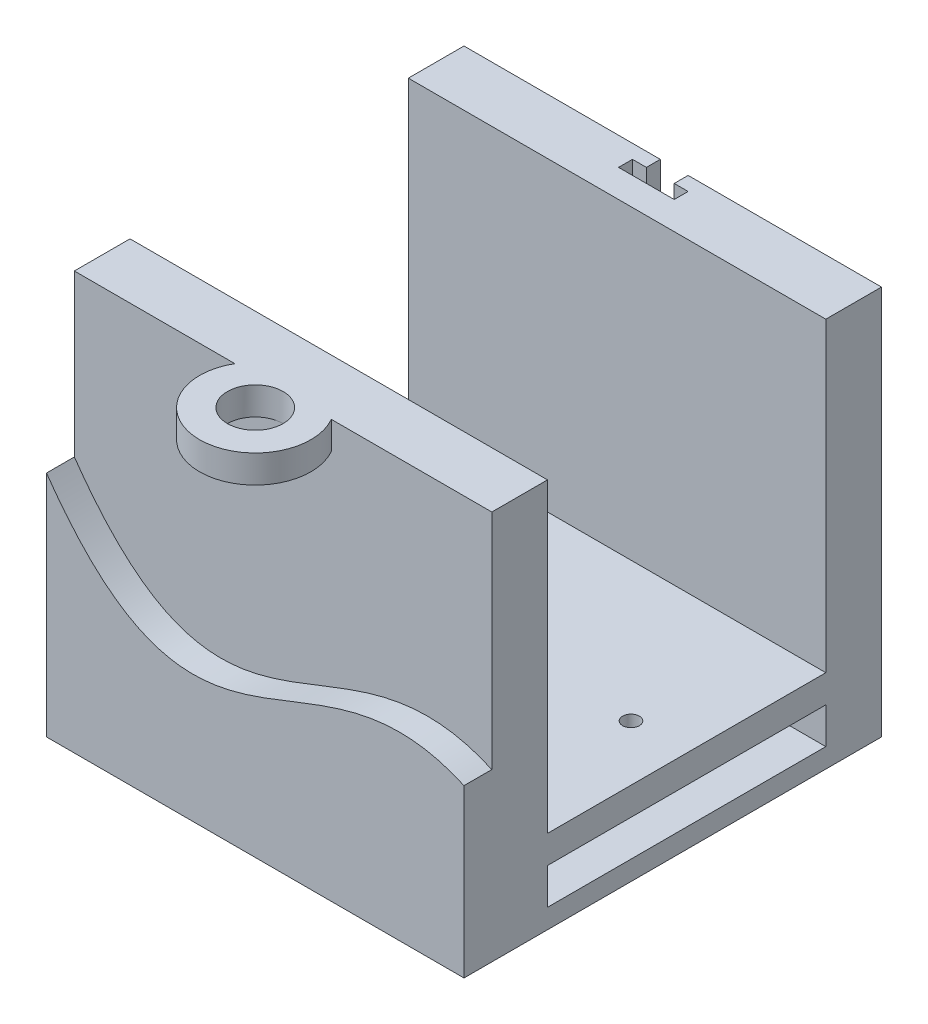
ISO-10303-21;
HEADER;
FILE_DESCRIPTION(('STEP AP214'),'2;1');
FILE_NAME('part.step','',(''),(''),'','','');
FILE_SCHEMA(('AUTOMOTIVE_DESIGN { 1 0 10303 214 1 1 1 1 }'));
ENDSEC;
DATA;
#1=APPLICATION_CONTEXT('core data for automotive mechanical design processes');
#2=APPLICATION_PROTOCOL_DEFINITION('international standard','automotive_design',2000,#1);
#3=PRODUCT_CONTEXT('',#1,'mechanical');
#4=PRODUCT('Part','Part','',(#3));
#5=PRODUCT_RELATED_PRODUCT_CATEGORY('part','',(#4));
#6=PRODUCT_DEFINITION_FORMATION('','',#4);
#7=PRODUCT_DEFINITION_CONTEXT('part definition',#1,'design');
#8=PRODUCT_DEFINITION('design','',#6,#7);
#9=PRODUCT_DEFINITION_SHAPE('','',#8);
#10=(LENGTH_UNIT() NAMED_UNIT(*) SI_UNIT(.MILLI.,.METRE.));
#11=(NAMED_UNIT(*) PLANE_ANGLE_UNIT() SI_UNIT($,.RADIAN.));
#12=(NAMED_UNIT(*) SI_UNIT($,.STERADIAN.) SOLID_ANGLE_UNIT());
#13=UNCERTAINTY_MEASURE_WITH_UNIT(LENGTH_MEASURE(1.E-05),#10,'distance_accuracy_value','');
#14=(GEOMETRIC_REPRESENTATION_CONTEXT(3) GLOBAL_UNCERTAINTY_ASSIGNED_CONTEXT((#13)) GLOBAL_UNIT_ASSIGNED_CONTEXT((#10,
#11,#12)) REPRESENTATION_CONTEXT('',''));
#15=CARTESIAN_POINT('',(0.,0.,0.));
#16=DIRECTION('',(0.,0.,1.));
#17=DIRECTION('',(1.,0.,0.));
#18=AXIS2_PLACEMENT_3D('',#15,#16,#17);
#19=CARTESIAN_POINT('',(-59.1428571428571,140.,104.214285714286));
#20=DIRECTION('',(0.,0.,-1.));
#21=DIRECTION('',(-1.,0.,0.));
#22=AXIS2_PLACEMENT_3D('',#19,#20,#21);
#23=PLANE('',#22);
#24=CARTESIAN_POINT('',(90.8571428571429,59.8589171198965,104.214285714286));
#25=CARTESIAN_POINT('',(33.520042850717,85.660046612702,104.214285714286));
#26=CARTESIAN_POINT('',(-2.26068441468296,0.574504188188582,104.214285714286));
#27=CARTESIAN_POINT('',(-59.1428571428571,82.1360500040591,104.214285714286));
#28=B_SPLINE_CURVE_WITH_KNOTS('',3,(#24,#25,#26,#27),.UNSPECIFIED.,.F.,.F.,(4,4),(0.,1.),.UNSPECIFIED.);
#29=CARTESIAN_POINT('',(90.8571428571429,59.8589171198965,104.214285714286));
#30=VERTEX_POINT('',#29);
#31=CARTESIAN_POINT('',(-59.1428571428571,82.1360500040591,104.214285714286));
#32=VERTEX_POINT('',#31);
#33=EDGE_CURVE('E58',#30,#32,#28,.T.);
#34=ORIENTED_EDGE('',*,*,#33,.F.);
#35=DIRECTION('',(0.,-1.,0.));
#36=VECTOR('',#35,1.);
#37=CARTESIAN_POINT('',(90.8571428571429,140.,104.214285714286));
#38=LINE('',#37,#36);
#39=CARTESIAN_POINT('',(90.8571428571429,140.,104.214285714286));
#40=VERTEX_POINT('',#39);
#41=EDGE_CURVE('E406',#40,#30,#38,.T.);
#42=ORIENTED_EDGE('',*,*,#41,.F.);
#43=DIRECTION('',(1.,0.,0.));
#44=VECTOR('',#43,1.);
#45=CARTESIAN_POINT('',(-59.1428571428571,140.,104.214285714286));
#46=LINE('',#45,#44);
#47=CARTESIAN_POINT('',(33.1776509328317,140.,104.214285714286));
#48=VERTEX_POINT('',#47);
#49=EDGE_CURVE('E383',#48,#40,#46,.T.);
#50=ORIENTED_EDGE('',*,*,#49,.F.);
#51=DIRECTION('',(0.,1.,0.));
#52=VECTOR('',#51,1.);
#53=CARTESIAN_POINT('',(33.1776509328317,130.,104.214285714286));
#54=LINE('',#53,#52);
#55=CARTESIAN_POINT('',(33.1776509328317,130.,104.214285714286));
#56=VERTEX_POINT('',#55);
#57=EDGE_CURVE('E296',#48,#56,#54,.F.);
#58=ORIENTED_EDGE('',*,*,#57,.T.);
#59=DIRECTION('',(1.,0.,0.));
#60=VECTOR('',#59,1.);
#61=CARTESIAN_POINT('',(-59.1428571428571,130.,104.214285714286));
#62=LINE('',#61,#60);
#63=CARTESIAN_POINT('',(15.8571428571429,130.,104.214285714286));
#64=VERTEX_POINT('',#63);
#65=EDGE_CURVE('E42',#64,#56,#62,.T.);
#66=ORIENTED_EDGE('',*,*,#65,.F.);
#67=CARTESIAN_POINT('',(-1.46336521854585,130.,104.214285714286));
#68=VERTEX_POINT('',#67);
#69=EDGE_CURVE('E12',#68,#64,#62,.T.);
#70=ORIENTED_EDGE('',*,*,#69,.F.);
#71=DIRECTION('',(0.,1.,0.));
#72=VECTOR('',#71,1.);
#73=CARTESIAN_POINT('',(-1.46336521854585,130.,104.214285714286));
#74=LINE('',#73,#72);
#75=CARTESIAN_POINT('',(-1.46336521854585,140.,104.214285714286));
#76=VERTEX_POINT('',#75);
#77=EDGE_CURVE('E300',#68,#76,#74,.T.);
#78=ORIENTED_EDGE('',*,*,#77,.T.);
#79=CARTESIAN_POINT('',(-59.1428571428571,140.,104.214285714286));
#80=VERTEX_POINT('',#79);
#81=EDGE_CURVE('E385',#80,#76,#46,.T.);
#82=ORIENTED_EDGE('',*,*,#81,.F.);
#83=DIRECTION('',(0.,-1.,0.));
#84=VECTOR('',#83,1.);
#85=CARTESIAN_POINT('',(-59.1428571428571,140.,104.214285714286));
#86=LINE('',#85,#84);
#87=EDGE_CURVE('E53',#80,#32,#86,.T.);
#88=ORIENTED_EDGE('',*,*,#87,.T.);
#89=EDGE_LOOP('',(#34,#42,#50,#58,#66,#70,#78,#82,#88));
#90=FACE_BOUND('',#89,.T.);
#91=ADVANCED_FACE('F38',(#90),#23,.F.);
#92=CARTESIAN_POINT('',(0.,140.,0.));
#93=DIRECTION('',(0.,1.,0.));
#94=DIRECTION('',(0.,0.,1.));
#95=AXIS2_PLACEMENT_3D('',#92,#93,#94);
#96=PLANE('',#95);
#97=DIRECTION('',(-1.,0.,0.));
#98=VECTOR('',#97,1.);
#99=CARTESIAN_POINT('',(6.38285753722225,140.,-30.7857142857143));
#100=LINE('',#99,#98);
#101=CARTESIAN_POINT('',(11.3828575372223,140.,-30.7857142857143));
#102=VERTEX_POINT('',#101);
#103=CARTESIAN_POINT('',(6.38285753722225,140.,-30.7857142857143));
#104=VERTEX_POINT('',#103);
#105=EDGE_CURVE('E246',#102,#104,#100,.T.);
#106=ORIENTED_EDGE('',*,*,#105,.F.);
#107=DIRECTION('',(0.,0.,1.));
#108=VECTOR('',#107,1.);
#109=CARTESIAN_POINT('',(11.3828575372222,140.,-35.7857142857143));
#110=LINE('',#109,#108);
#111=CARTESIAN_POINT('',(11.3828575372222,140.,-35.7857142857143));
#112=VERTEX_POINT('',#111);
#113=EDGE_CURVE('E278',#112,#102,#110,.T.);
#114=ORIENTED_EDGE('',*,*,#113,.F.);
#115=DIRECTION('',(-1.,0.,0.));
#116=VECTOR('',#115,1.);
#117=CARTESIAN_POINT('',(-59.1428571428571,140.,-35.7857142857143));
#118=LINE('',#117,#116);
#119=CARTESIAN_POINT('',(-59.1428571428571,140.,-35.7857142857143));
#120=VERTEX_POINT('',#119);
#121=EDGE_CURVE('E392',#112,#120,#118,.T.);
#122=ORIENTED_EDGE('',*,*,#121,.T.);
#123=DIRECTION('',(0.,0.,1.));
#124=VECTOR('',#123,1.);
#125=CARTESIAN_POINT('',(-59.1428571428571,140.,-35.7857142857143));
#126=LINE('',#125,#124);
#127=CARTESIAN_POINT('',(-59.1428571428571,140.,-15.7857142857143));
#128=VERTEX_POINT('',#127);
#129=EDGE_CURVE('E380',#120,#128,#126,.T.);
#130=ORIENTED_EDGE('',*,*,#129,.T.);
#131=DIRECTION('',(-1.,0.,0.));
#132=VECTOR('',#131,1.);
#133=CARTESIAN_POINT('',(-59.1428571428571,140.,-15.7857142857143));
#134=LINE('',#133,#132);
#135=CARTESIAN_POINT('',(90.8571428571429,140.,-15.7857142857143));
#136=VERTEX_POINT('',#135);
#137=EDGE_CURVE('E360',#136,#128,#134,.T.);
#138=ORIENTED_EDGE('',*,*,#137,.F.);
#139=DIRECTION('',(0.,0.,-1.));
#140=VECTOR('',#139,1.);
#141=CARTESIAN_POINT('',(90.8571428571429,140.,-35.7857142857143));
#142=LINE('',#141,#140);
#143=CARTESIAN_POINT('',(90.8571428571429,140.,-35.7857142857143));
#144=VERTEX_POINT('',#143);
#145=EDGE_CURVE('E388',#136,#144,#142,.T.);
#146=ORIENTED_EDGE('',*,*,#145,.T.);
#147=CARTESIAN_POINT('',(21.3828575372223,140.,-35.7857142857143));
#148=VERTEX_POINT('',#147);
#149=EDGE_CURVE('E393',#144,#148,#118,.T.);
#150=ORIENTED_EDGE('',*,*,#149,.T.);
#151=DIRECTION('',(0.,0.,-1.));
#152=VECTOR('',#151,1.);
#153=CARTESIAN_POINT('',(21.3828575372223,140.,-35.7857142857143));
#154=LINE('',#153,#152);
#155=CARTESIAN_POINT('',(21.3828575372223,140.,-30.7857142857143));
#156=VERTEX_POINT('',#155);
#157=EDGE_CURVE('E264',#156,#148,#154,.T.);
#158=ORIENTED_EDGE('',*,*,#157,.F.);
#159=CARTESIAN_POINT('',(26.3828575372223,140.,-30.7857142857143));
#160=VERTEX_POINT('',#159);
#161=EDGE_CURVE('E237',#160,#156,#100,.T.);
#162=ORIENTED_EDGE('',*,*,#161,.F.);
#163=DIRECTION('',(0.,0.,-1.));
#164=VECTOR('',#163,1.);
#165=CARTESIAN_POINT('',(26.3828575372223,140.,-25.7857142857143));
#166=LINE('',#165,#164);
#167=CARTESIAN_POINT('',(26.3828575372223,140.,-25.7857142857143));
#168=VERTEX_POINT('',#167);
#169=EDGE_CURVE('E228',#168,#160,#166,.T.);
#170=ORIENTED_EDGE('',*,*,#169,.F.);
#171=DIRECTION('',(1.,0.,0.));
#172=VECTOR('',#171,1.);
#173=CARTESIAN_POINT('',(21.3828575372223,140.,-25.7857142857143));
#174=LINE('',#173,#172);
#175=CARTESIAN_POINT('',(6.38285753722225,140.,-25.7857142857143));
#176=VERTEX_POINT('',#175);
#177=EDGE_CURVE('E268',#176,#168,#174,.T.);
#178=ORIENTED_EDGE('',*,*,#177,.F.);
#179=DIRECTION('',(0.,0.,1.));
#180=VECTOR('',#179,1.);
#181=CARTESIAN_POINT('',(6.38285753722225,140.,-25.7857142857143));
#182=LINE('',#181,#180);
#183=EDGE_CURVE('E224',#104,#176,#182,.T.);
#184=ORIENTED_EDGE('',*,*,#183,.F.);
#185=EDGE_LOOP('',(#106,#114,#122,#130,#138,#146,#150,#158,#162,#170,#178,#184));
#186=FACE_BOUND('',#185,.T.);
#187=ADVANCED_FACE('F434',(#186),#96,.T.);
#188=CARTESIAN_POINT('',(-59.1428571428571,140.,-35.7857142857143));
#189=DIRECTION('',(1.,0.,0.));
#190=DIRECTION('',(0.,0.,-1.));
#191=AXIS2_PLACEMENT_3D('',#188,#189,#190);
#192=PLANE('',#191);
#193=DIRECTION('',(0.,0.,1.));
#194=VECTOR('',#193,1.);
#195=CARTESIAN_POINT('',(-59.1428571428571,20.,84.2142857142858));
#196=LINE('',#195,#194);
#197=CARTESIAN_POINT('',(-59.1428571428572,20.,-15.7857142857143));
#198=VERTEX_POINT('',#197);
#199=CARTESIAN_POINT('',(-59.1428571428571,20.,84.2142857142858));
#200=VERTEX_POINT('',#199);
#201=EDGE_CURVE('E334',#198,#200,#196,.T.);
#202=ORIENTED_EDGE('',*,*,#201,.T.);
#203=DIRECTION('',(0.,-1.,0.));
#204=VECTOR('',#203,1.);
#205=CARTESIAN_POINT('',(-59.1428571428571,20.,84.2142857142858));
#206=LINE('',#205,#204);
#207=CARTESIAN_POINT('',(-59.1428571428571,7.,84.2142857142858));
#208=VERTEX_POINT('',#207);
#209=EDGE_CURVE('E324',#200,#208,#206,.T.);
#210=ORIENTED_EDGE('',*,*,#209,.T.);
#211=DIRECTION('',(0.,0.,-1.));
#212=VECTOR('',#211,1.);
#213=CARTESIAN_POINT('',(-59.1428571428571,7.,84.2142857142858));
#214=LINE('',#213,#212);
#215=CARTESIAN_POINT('',(-59.1428571428571,7.00000000000001,-15.7857142857143));
#216=VERTEX_POINT('',#215);
#217=EDGE_CURVE('E327',#208,#216,#214,.T.);
#218=ORIENTED_EDGE('',*,*,#217,.T.);
#219=DIRECTION('',(0.,1.,0.));
#220=VECTOR('',#219,1.);
#221=CARTESIAN_POINT('',(-59.1428571428572,20.,-15.7857142857143));
#222=LINE('',#221,#220);
#223=EDGE_CURVE('E331',#216,#198,#222,.T.);
#224=ORIENTED_EDGE('',*,*,#223,.T.);
#225=EDGE_LOOP('',(#202,#210,#218,#224));
#226=FACE_BOUND('',#225,.T.);
#227=DIRECTION('',(0.,0.,1.));
#228=VECTOR('',#227,1.);
#229=CARTESIAN_POINT('',(-59.1428571428571,30.,-15.7857142857143));
#230=LINE('',#229,#228);
#231=CARTESIAN_POINT('',(-59.1428571428571,30.,-15.7857142857143));
#232=VERTEX_POINT('',#231);
#233=CARTESIAN_POINT('',(-59.1428571428571,30.,84.2142857142857));
#234=VERTEX_POINT('',#233);
#235=EDGE_CURVE('E356',#232,#234,#230,.T.);
#236=ORIENTED_EDGE('',*,*,#235,.F.);
#237=DIRECTION('',(0.,1.,0.));
#238=VECTOR('',#237,1.);
#239=CARTESIAN_POINT('',(-59.1428571428571,30.,-15.7857142857143));
#240=LINE('',#239,#238);
#241=EDGE_CURVE('E371',#232,#128,#240,.T.);
#242=ORIENTED_EDGE('',*,*,#241,.T.);
#243=ORIENTED_EDGE('',*,*,#129,.F.);
#244=DIRECTION('',(0.,-1.,0.));
#245=VECTOR('',#244,1.);
#246=CARTESIAN_POINT('',(-59.1428571428571,140.,-35.7857142857143));
#247=LINE('',#246,#245);
#248=CARTESIAN_POINT('',(-59.1428571428571,0.,-35.7857142857143));
#249=VERTEX_POINT('',#248);
#250=EDGE_CURVE('E396',#120,#249,#247,.T.);
#251=ORIENTED_EDGE('',*,*,#250,.T.);
#252=DIRECTION('',(0.,0.,1.));
#253=VECTOR('',#252,1.);
#254=CARTESIAN_POINT('',(-59.1428571428571,0.,-35.7857142857143));
#255=LINE('',#254,#253);
#256=CARTESIAN_POINT('',(-59.1428571428571,0.,114.214285714286));
#257=VERTEX_POINT('',#256);
#258=EDGE_CURVE('E208',#249,#257,#255,.T.);
#259=ORIENTED_EDGE('',*,*,#258,.T.);
#260=DIRECTION('',(0.,-1.,0.));
#261=VECTOR('',#260,1.);
#262=CARTESIAN_POINT('',(-59.1428571428571,82.1360500040591,114.214285714286));
#263=LINE('',#262,#261);
#264=CARTESIAN_POINT('',(-59.1428571428571,82.1360500040591,114.214285714286));
#265=VERTEX_POINT('',#264);
#266=EDGE_CURVE('E201',#265,#257,#263,.T.);
#267=ORIENTED_EDGE('',*,*,#266,.F.);
#268=DIRECTION('',(0.,0.,-1.));
#269=VECTOR('',#268,1.);
#270=CARTESIAN_POINT('',(-59.1428571428571,82.1360500040591,114.214285714286));
#271=LINE('',#270,#269);
#272=EDGE_CURVE('E205',#265,#32,#271,.T.);
#273=ORIENTED_EDGE('',*,*,#272,.T.);
#274=ORIENTED_EDGE('',*,*,#87,.F.);
#275=CARTESIAN_POINT('',(-59.1428571428571,140.,84.2142857142857));
#276=VERTEX_POINT('',#275);
#277=EDGE_CURVE('E384',#276,#80,#126,.T.);
#278=ORIENTED_EDGE('',*,*,#277,.F.);
#279=DIRECTION('',(0.,1.,0.));
#280=VECTOR('',#279,1.);
#281=CARTESIAN_POINT('',(-59.1428571428571,30.,84.2142857142857));
#282=LINE('',#281,#280);
#283=EDGE_CURVE('E368',#234,#276,#282,.T.);
#284=ORIENTED_EDGE('',*,*,#283,.F.);
#285=EDGE_LOOP('',(#236,#242,#243,#251,#259,#267,#273,#274,#278,#284));
#286=FACE_BOUND('',#285,.T.);
#287=ADVANCED_FACE('F40',(#226,#286),#192,.F.);
#288=CARTESIAN_POINT('',(90.8571428571429,140.,-35.7857142857143));
#289=DIRECTION('',(-1.,0.,0.));
#290=DIRECTION('',(0.,0.,1.));
#291=AXIS2_PLACEMENT_3D('',#288,#289,#290);
#292=PLANE('',#291);
#293=DIRECTION('',(0.,0.,-1.));
#294=VECTOR('',#293,1.);
#295=CARTESIAN_POINT('',(90.8571428571429,7.,84.2142857142857));
#296=LINE('',#295,#294);
#297=CARTESIAN_POINT('',(90.8571428571429,7.00000000000001,84.2142857142857));
#298=VERTEX_POINT('',#297);
#299=CARTESIAN_POINT('',(90.8571428571429,7.,-15.7857142857143));
#300=VERTEX_POINT('',#299);
#301=EDGE_CURVE('E339',#298,#300,#296,.T.);
#302=ORIENTED_EDGE('',*,*,#301,.F.);
#303=DIRECTION('',(0.,-1.,0.));
#304=VECTOR('',#303,1.);
#305=CARTESIAN_POINT('',(90.8571428571429,20.,84.2142857142857));
#306=LINE('',#305,#304);
#307=CARTESIAN_POINT('',(90.8571428571429,20.,84.2142857142857));
#308=VERTEX_POINT('',#307);
#309=EDGE_CURVE('E323',#308,#298,#306,.T.);
#310=ORIENTED_EDGE('',*,*,#309,.F.);
#311=DIRECTION('',(0.,0.,1.));
#312=VECTOR('',#311,1.);
#313=CARTESIAN_POINT('',(90.8571428571429,20.,84.2142857142857));
#314=LINE('',#313,#312);
#315=CARTESIAN_POINT('',(90.8571428571429,20.,-15.7857142857143));
#316=VERTEX_POINT('',#315);
#317=EDGE_CURVE('E328',#316,#308,#314,.T.);
#318=ORIENTED_EDGE('',*,*,#317,.F.);
#319=DIRECTION('',(0.,1.,0.));
#320=VECTOR('',#319,1.);
#321=CARTESIAN_POINT('',(90.8571428571429,20.,-15.7857142857143));
#322=LINE('',#321,#320);
#323=EDGE_CURVE('E342',#300,#316,#322,.T.);
#324=ORIENTED_EDGE('',*,*,#323,.F.);
#325=EDGE_LOOP('',(#302,#310,#318,#324));
#326=FACE_BOUND('',#325,.T.);
#327=ORIENTED_EDGE('',*,*,#145,.F.);
#328=DIRECTION('',(0.,1.,0.));
#329=VECTOR('',#328,1.);
#330=CARTESIAN_POINT('',(90.8571428571429,30.,-15.7857142857143));
#331=LINE('',#330,#329);
#332=CARTESIAN_POINT('',(90.8571428571429,30.,-15.7857142857143));
#333=VERTEX_POINT('',#332);
#334=EDGE_CURVE('E374',#333,#136,#331,.T.);
#335=ORIENTED_EDGE('',*,*,#334,.F.);
#336=DIRECTION('',(0.,0.,-1.));
#337=VECTOR('',#336,1.);
#338=CARTESIAN_POINT('',(90.8571428571429,30.,-15.7857142857143));
#339=LINE('',#338,#337);
#340=CARTESIAN_POINT('',(90.8571428571429,30.,84.2142857142857));
#341=VERTEX_POINT('',#340);
#342=EDGE_CURVE('E363',#341,#333,#339,.T.);
#343=ORIENTED_EDGE('',*,*,#342,.F.);
#344=DIRECTION('',(0.,1.,0.));
#345=VECTOR('',#344,1.);
#346=CARTESIAN_POINT('',(90.8571428571429,30.,84.2142857142857));
#347=LINE('',#346,#345);
#348=CARTESIAN_POINT('',(90.8571428571429,140.,84.2142857142857));
#349=VERTEX_POINT('',#348);
#350=EDGE_CURVE('E376',#341,#349,#347,.T.);
#351=ORIENTED_EDGE('',*,*,#350,.T.);
#352=EDGE_CURVE('E389',#40,#349,#142,.T.);
#353=ORIENTED_EDGE('',*,*,#352,.F.);
#354=ORIENTED_EDGE('',*,*,#41,.T.);
#355=DIRECTION('',(0.,0.,-1.));
#356=VECTOR('',#355,1.);
#357=CARTESIAN_POINT('',(90.8571428571429,59.8589171198965,114.214285714286));
#358=LINE('',#357,#356);
#359=CARTESIAN_POINT('',(90.8571428571429,59.8589171198965,114.214285714286));
#360=VERTEX_POINT('',#359);
#361=EDGE_CURVE('E225',#360,#30,#358,.T.);
#362=ORIENTED_EDGE('',*,*,#361,.F.);
#363=DIRECTION('',(0.,1.,0.));
#364=VECTOR('',#363,1.);
#365=CARTESIAN_POINT('',(90.8571428571429,0.,114.214285714286));
#366=LINE('',#365,#364);
#367=CARTESIAN_POINT('',(90.8571428571429,0.,114.214285714286));
#368=VERTEX_POINT('',#367);
#369=EDGE_CURVE('E218',#368,#360,#366,.T.);
#370=ORIENTED_EDGE('',*,*,#369,.F.);
#371=DIRECTION('',(0.,0.,-1.));
#372=VECTOR('',#371,1.);
#373=CARTESIAN_POINT('',(90.8571428571429,0.,-35.7857142857143));
#374=LINE('',#373,#372);
#375=CARTESIAN_POINT('',(90.8571428571429,0.,-35.7857142857143));
#376=VERTEX_POINT('',#375);
#377=EDGE_CURVE('E398',#368,#376,#374,.T.);
#378=ORIENTED_EDGE('',*,*,#377,.T.);
#379=DIRECTION('',(0.,-1.,0.));
#380=VECTOR('',#379,1.);
#381=CARTESIAN_POINT('',(90.8571428571429,140.,-35.7857142857143));
#382=LINE('',#381,#380);
#383=EDGE_CURVE('E403',#144,#376,#382,.T.);
#384=ORIENTED_EDGE('',*,*,#383,.F.);
#385=EDGE_LOOP('',(#327,#335,#343,#351,#353,#354,#362,#370,#378,#384));
#386=FACE_BOUND('',#385,.T.);
#387=ADVANCED_FACE('F442',(#326,#386),#292,.F.);
#388=CARTESIAN_POINT('',(-59.1428571428571,140.,-35.7857142857143));
#389=DIRECTION('',(0.,0.,1.));
#390=DIRECTION('',(1.,0.,0.));
#391=AXIS2_PLACEMENT_3D('',#388,#389,#390);
#392=PLANE('',#391);
#393=DIRECTION('',(-1.,0.,0.));
#394=VECTOR('',#393,1.);
#395=CARTESIAN_POINT('',(21.3828575372223,20.,-35.7857142857143));
#396=LINE('',#395,#394);
#397=CARTESIAN_POINT('',(21.3828575372222,20.,-35.7857142857143));
#398=VERTEX_POINT('',#397);
#399=CARTESIAN_POINT('',(11.3828575372222,20.,-35.7857142857143));
#400=VERTEX_POINT('',#399);
#401=EDGE_CURVE('E267',#398,#400,#396,.T.);
#402=ORIENTED_EDGE('',*,*,#401,.F.);
#403=DIRECTION('',(0.,1.,0.));
#404=VECTOR('',#403,1.);
#405=CARTESIAN_POINT('',(21.3828575372223,20.,-35.7857142857143));
#406=LINE('',#405,#404);
#407=EDGE_CURVE('E276',#398,#148,#406,.T.);
#408=ORIENTED_EDGE('',*,*,#407,.T.);
#409=ORIENTED_EDGE('',*,*,#149,.F.);
#410=ORIENTED_EDGE('',*,*,#383,.T.);
#411=DIRECTION('',(-1.,0.,0.));
#412=VECTOR('',#411,1.);
#413=CARTESIAN_POINT('',(-59.1428571428571,0.,-35.7857142857143));
#414=LINE('',#413,#412);
#415=EDGE_CURVE('E400',#376,#249,#414,.T.);
#416=ORIENTED_EDGE('',*,*,#415,.T.);
#417=ORIENTED_EDGE('',*,*,#250,.F.);
#418=ORIENTED_EDGE('',*,*,#121,.F.);
#419=DIRECTION('',(0.,1.,0.));
#420=VECTOR('',#419,1.);
#421=CARTESIAN_POINT('',(11.3828575372222,20.,-35.7857142857143));
#422=LINE('',#421,#420);
#423=EDGE_CURVE('E282',#400,#112,#422,.T.);
#424=ORIENTED_EDGE('',*,*,#423,.F.);
#425=EDGE_LOOP('',(#402,#408,#409,#410,#416,#417,#418,#424));
#426=FACE_BOUND('',#425,.T.);
#427=ADVANCED_FACE('F445',(#426),#392,.F.);
#428=CARTESIAN_POINT('',(15.8571428571429,140.,114.214285714286));
#429=DIRECTION('',(0.,1.,0.));
#430=DIRECTION('',(0.,0.,1.));
#431=AXIS2_PLACEMENT_3D('',#428,#429,#430);
#432=CIRCLE('',#431,10.);
#433=CARTESIAN_POINT('',(15.8571428571429,140.,124.214285714286));
#434=VERTEX_POINT('',#433);
#435=EDGE_CURVE('E284',#434,#434,#432,.T.);
#436=ORIENTED_EDGE('',*,*,#435,.F.);
#437=EDGE_LOOP('',(#436));
#438=FACE_BOUND('',#437,.T.);
#439=ORIENTED_EDGE('',*,*,#81,.T.);
#440=CARTESIAN_POINT('',(15.8571428571429,140.,114.214285714286));
#441=DIRECTION('',(0.,1.,0.));
#442=DIRECTION('',(1.,0.,0.));
#443=AXIS2_PLACEMENT_3D('',#440,#441,#442);
#444=CIRCLE('',#443,20.);
#445=EDGE_CURVE('E290',#76,#48,#444,.T.);
#446=ORIENTED_EDGE('',*,*,#445,.T.);
#447=ORIENTED_EDGE('',*,*,#49,.T.);
#448=ORIENTED_EDGE('',*,*,#352,.T.);
#449=DIRECTION('',(1.,0.,0.));
#450=VECTOR('',#449,1.);
#451=CARTESIAN_POINT('',(-59.1428571428571,140.,84.2142857142857));
#452=LINE('',#451,#450);
#453=EDGE_CURVE('E349',#276,#349,#452,.T.);
#454=ORIENTED_EDGE('',*,*,#453,.F.);
#455=ORIENTED_EDGE('',*,*,#277,.T.);
#456=EDGE_LOOP('',(#439,#446,#447,#448,#454,#455));
#457=FACE_BOUND('',#456,.T.);
#458=ADVANCED_FACE('F440',(#438,#457),#96,.T.);
#459=CARTESIAN_POINT('',(0.,0.,0.));
#460=DIRECTION('',(0.,1.,0.));
#461=DIRECTION('',(0.,0.,1.));
#462=AXIS2_PLACEMENT_3D('',#459,#460,#461);
#463=PLANE('',#462);
#464=CARTESIAN_POINT('',(-29.1428571428571,0.,34.2142857142857));
#465=DIRECTION('',(0.,1.,0.));
#466=DIRECTION('',(0.,0.,1.));
#467=AXIS2_PLACEMENT_3D('',#464,#465,#466);
#468=CIRCLE('',#467,3.);
#469=CARTESIAN_POINT('',(-29.1428571428571,0.,37.2142857142857));
#470=VERTEX_POINT('',#469);
#471=EDGE_CURVE('E304',#470,#470,#468,.T.);
#472=ORIENTED_EDGE('',*,*,#471,.T.);
#473=EDGE_LOOP('',(#472));
#474=FACE_BOUND('',#473,.T.);
#475=CARTESIAN_POINT('',(70.8571428571429,0.,34.2142857142857));
#476=DIRECTION('',(0.,1.,0.));
#477=DIRECTION('',(0.,0.,1.));
#478=AXIS2_PLACEMENT_3D('',#475,#476,#477);
#479=CIRCLE('',#478,3.00000000000001);
#480=CARTESIAN_POINT('',(70.8571428571429,0.,37.2142857142857));
#481=VERTEX_POINT('',#480);
#482=EDGE_CURVE('E320',#481,#481,#479,.T.);
#483=ORIENTED_EDGE('',*,*,#482,.T.);
#484=EDGE_LOOP('',(#483));
#485=FACE_BOUND('',#484,.T.);
#486=ORIENTED_EDGE('',*,*,#258,.F.);
#487=ORIENTED_EDGE('',*,*,#415,.F.);
#488=ORIENTED_EDGE('',*,*,#377,.F.);
#489=DIRECTION('',(1.,0.,0.));
#490=VECTOR('',#489,1.);
#491=CARTESIAN_POINT('',(-59.1428571428571,0.,114.214285714286));
#492=LINE('',#491,#490);
#493=EDGE_CURVE('E212',#257,#368,#492,.T.);
#494=ORIENTED_EDGE('',*,*,#493,.F.);
#495=EDGE_LOOP('',(#486,#487,#488,#494));
#496=FACE_BOUND('',#495,.T.);
#497=ADVANCED_FACE('F450',(#474,#485,#496),#463,.F.);
#498=CARTESIAN_POINT('',(-59.1428571428571,30.,-15.7857142857143));
#499=DIRECTION('',(0.,0.,-1.));
#500=DIRECTION('',(-1.,0.,0.));
#501=AXIS2_PLACEMENT_3D('',#498,#499,#500);
#502=PLANE('',#501);
#503=ORIENTED_EDGE('',*,*,#137,.T.);
#504=ORIENTED_EDGE('',*,*,#241,.F.);
#505=DIRECTION('',(-1.,0.,0.));
#506=VECTOR('',#505,1.);
#507=CARTESIAN_POINT('',(-59.1428571428571,30.,-15.7857142857143));
#508=LINE('',#507,#506);
#509=EDGE_CURVE('E365',#333,#232,#508,.T.);
#510=ORIENTED_EDGE('',*,*,#509,.F.);
#511=ORIENTED_EDGE('',*,*,#334,.T.);
#512=EDGE_LOOP('',(#503,#504,#510,#511));
#513=FACE_BOUND('',#512,.T.);
#514=ADVANCED_FACE('F452',(#513),#502,.F.);
#515=CARTESIAN_POINT('',(-59.1428571428571,30.,84.2142857142857));
#516=DIRECTION('',(0.,0.,1.));
#517=DIRECTION('',(1.,0.,0.));
#518=AXIS2_PLACEMENT_3D('',#515,#516,#517);
#519=PLANE('',#518);
#520=ORIENTED_EDGE('',*,*,#453,.T.);
#521=ORIENTED_EDGE('',*,*,#350,.F.);
#522=DIRECTION('',(1.,0.,0.));
#523=VECTOR('',#522,1.);
#524=CARTESIAN_POINT('',(-59.1428571428571,30.,84.2142857142857));
#525=LINE('',#524,#523);
#526=EDGE_CURVE('E359',#234,#341,#525,.T.);
#527=ORIENTED_EDGE('',*,*,#526,.F.);
#528=ORIENTED_EDGE('',*,*,#283,.T.);
#529=EDGE_LOOP('',(#520,#521,#527,#528));
#530=FACE_BOUND('',#529,.T.);
#531=ADVANCED_FACE('F457',(#530),#519,.F.);
#532=CARTESIAN_POINT('',(0.,30.,0.));
#533=DIRECTION('',(0.,1.,0.));
#534=DIRECTION('',(0.,0.,1.));
#535=AXIS2_PLACEMENT_3D('',#532,#533,#534);
#536=PLANE('',#535);
#537=CARTESIAN_POINT('',(-29.1428571428571,30.,34.2142857142857));
#538=DIRECTION('',(0.,1.,0.));
#539=DIRECTION('',(0.,0.,1.));
#540=AXIS2_PLACEMENT_3D('',#537,#538,#539);
#541=CIRCLE('',#540,3.);
#542=CARTESIAN_POINT('',(-29.1428571428571,30.,37.2142857142857));
#543=VERTEX_POINT('',#542);
#544=EDGE_CURVE('E303',#543,#543,#541,.T.);
#545=ORIENTED_EDGE('',*,*,#544,.F.);
#546=EDGE_LOOP('',(#545));
#547=FACE_BOUND('',#546,.T.);
#548=CARTESIAN_POINT('',(70.8571428571429,30.,34.2142857142857));
#549=DIRECTION('',(0.,1.,0.));
#550=DIRECTION('',(0.,0.,1.));
#551=AXIS2_PLACEMENT_3D('',#548,#549,#550);
#552=CIRCLE('',#551,3.00000000000001);
#553=CARTESIAN_POINT('',(70.8571428571429,30.,37.2142857142857));
#554=VERTEX_POINT('',#553);
#555=EDGE_CURVE('E313',#554,#554,#552,.T.);
#556=ORIENTED_EDGE('',*,*,#555,.F.);
#557=EDGE_LOOP('',(#556));
#558=FACE_BOUND('',#557,.T.);
#559=ORIENTED_EDGE('',*,*,#235,.T.);
#560=ORIENTED_EDGE('',*,*,#526,.T.);
#561=ORIENTED_EDGE('',*,*,#342,.T.);
#562=ORIENTED_EDGE('',*,*,#509,.T.);
#563=EDGE_LOOP('',(#559,#560,#561,#562));
#564=FACE_BOUND('',#563,.T.);
#565=ADVANCED_FACE('F460',(#547,#558,#564),#536,.T.);
#566=CARTESIAN_POINT('',(-59.1428571428571,20.,84.2142857142858));
#567=DIRECTION('',(0.,0.,1.));
#568=DIRECTION('',(1.,0.,0.));
#569=AXIS2_PLACEMENT_3D('',#566,#567,#568);
#570=PLANE('',#569);
#571=ORIENTED_EDGE('',*,*,#309,.T.);
#572=DIRECTION('',(1.,0.,0.));
#573=VECTOR('',#572,1.);
#574=CARTESIAN_POINT('',(-59.1428571428571,7.,84.2142857142858));
#575=LINE('',#574,#573);
#576=EDGE_CURVE('E337',#208,#298,#575,.T.);
#577=ORIENTED_EDGE('',*,*,#576,.F.);
#578=ORIENTED_EDGE('',*,*,#209,.F.);
#579=DIRECTION('',(1.,0.,0.));
#580=VECTOR('',#579,1.);
#581=CARTESIAN_POINT('',(-59.1428571428571,20.,84.2142857142858));
#582=LINE('',#581,#580);
#583=EDGE_CURVE('E347',#200,#308,#582,.T.);
#584=ORIENTED_EDGE('',*,*,#583,.T.);
#585=EDGE_LOOP('',(#571,#577,#578,#584));
#586=FACE_BOUND('',#585,.T.);
#587=ADVANCED_FACE('F467',(#586),#570,.F.);
#588=CARTESIAN_POINT('',(-59.1428571428571,20.,84.2142857142858));
#589=DIRECTION('',(0.,1.,0.));
#590=DIRECTION('',(0.,0.,1.));
#591=AXIS2_PLACEMENT_3D('',#588,#589,#590);
#592=PLANE('',#591);
#593=CARTESIAN_POINT('',(-29.1428571428571,20.,34.2142857142857));
#594=DIRECTION('',(0.,1.,0.));
#595=DIRECTION('',(0.,0.,1.));
#596=AXIS2_PLACEMENT_3D('',#593,#594,#595);
#597=CIRCLE('',#596,3.);
#598=CARTESIAN_POINT('',(-29.1428571428571,20.,37.2142857142857));
#599=VERTEX_POINT('',#598);
#600=EDGE_CURVE('E310',#599,#599,#597,.T.);
#601=ORIENTED_EDGE('',*,*,#600,.T.);
#602=EDGE_LOOP('',(#601));
#603=FACE_BOUND('',#602,.T.);
#604=CARTESIAN_POINT('',(70.8571428571429,20.,34.2142857142857));
#605=DIRECTION('',(0.,1.,0.));
#606=DIRECTION('',(0.,0.,1.));
#607=AXIS2_PLACEMENT_3D('',#604,#605,#606);
#608=CIRCLE('',#607,3.00000000000001);
#609=CARTESIAN_POINT('',(70.8571428571429,20.,37.2142857142857));
#610=VERTEX_POINT('',#609);
#611=EDGE_CURVE('E317',#610,#610,#608,.T.);
#612=ORIENTED_EDGE('',*,*,#611,.T.);
#613=EDGE_LOOP('',(#612));
#614=FACE_BOUND('',#613,.T.);
#615=ORIENTED_EDGE('',*,*,#317,.T.);
#616=ORIENTED_EDGE('',*,*,#583,.F.);
#617=ORIENTED_EDGE('',*,*,#201,.F.);
#618=DIRECTION('',(1.,0.,0.));
#619=VECTOR('',#618,1.);
#620=CARTESIAN_POINT('',(-59.1428571428572,20.,-15.7857142857143));
#621=LINE('',#620,#619);
#622=EDGE_CURVE('E350',#198,#316,#621,.T.);
#623=ORIENTED_EDGE('',*,*,#622,.T.);
#624=EDGE_LOOP('',(#615,#616,#617,#623));
#625=FACE_BOUND('',#624,.T.);
#626=ADVANCED_FACE('F471',(#603,#614,#625),#592,.F.);
#627=CARTESIAN_POINT('',(-59.1428571428572,20.,-15.7857142857143));
#628=DIRECTION('',(0.,0.,-1.));
#629=DIRECTION('',(-1.,0.,0.));
#630=AXIS2_PLACEMENT_3D('',#627,#628,#629);
#631=PLANE('',#630);
#632=ORIENTED_EDGE('',*,*,#323,.T.);
#633=ORIENTED_EDGE('',*,*,#622,.F.);
#634=ORIENTED_EDGE('',*,*,#223,.F.);
#635=DIRECTION('',(1.,0.,0.));
#636=VECTOR('',#635,1.);
#637=CARTESIAN_POINT('',(-59.1428571428572,7.,-15.7857142857143));
#638=LINE('',#637,#636);
#639=EDGE_CURVE('E352',#216,#300,#638,.T.);
#640=ORIENTED_EDGE('',*,*,#639,.T.);
#641=EDGE_LOOP('',(#632,#633,#634,#640));
#642=FACE_BOUND('',#641,.T.);
#643=ADVANCED_FACE('F475',(#642),#631,.F.);
#644=CARTESIAN_POINT('',(-59.1428571428571,7.,84.2142857142858));
#645=DIRECTION('',(0.,-1.,0.));
#646=DIRECTION('',(0.,0.,-1.));
#647=AXIS2_PLACEMENT_3D('',#644,#645,#646);
#648=PLANE('',#647);
#649=CARTESIAN_POINT('',(-29.1428571428571,7.,34.2142857142857));
#650=DIRECTION('',(0.,-1.,0.));
#651=DIRECTION('',(0.,0.,-1.));
#652=AXIS2_PLACEMENT_3D('',#649,#650,#651);
#653=CIRCLE('',#652,3.);
#654=CARTESIAN_POINT('',(-29.1428571428571,7.,31.2142857142857));
#655=VERTEX_POINT('',#654);
#656=EDGE_CURVE('E307',#655,#655,#653,.T.);
#657=ORIENTED_EDGE('',*,*,#656,.T.);
#658=EDGE_LOOP('',(#657));
#659=FACE_BOUND('',#658,.T.);
#660=CARTESIAN_POINT('',(70.8571428571429,7.,34.2142857142857));
#661=DIRECTION('',(0.,-1.,0.));
#662=DIRECTION('',(0.,0.,-1.));
#663=AXIS2_PLACEMENT_3D('',#660,#661,#662);
#664=CIRCLE('',#663,3.00000000000001);
#665=CARTESIAN_POINT('',(70.8571428571429,7.,31.2142857142857));
#666=VERTEX_POINT('',#665);
#667=EDGE_CURVE('E316',#666,#666,#664,.T.);
#668=ORIENTED_EDGE('',*,*,#667,.T.);
#669=EDGE_LOOP('',(#668));
#670=FACE_BOUND('',#669,.T.);
#671=ORIENTED_EDGE('',*,*,#301,.T.);
#672=ORIENTED_EDGE('',*,*,#639,.F.);
#673=ORIENTED_EDGE('',*,*,#217,.F.);
#674=ORIENTED_EDGE('',*,*,#576,.T.);
#675=EDGE_LOOP('',(#671,#672,#673,#674));
#676=FACE_BOUND('',#675,.T.);
#677=ADVANCED_FACE('F413',(#659,#670,#676),#648,.F.);
#678=CARTESIAN_POINT('',(70.8571428571429,-20.,34.2142857142857));
#679=DIRECTION('',(0.,1.,0.));
#680=DIRECTION('',(0.,0.,1.));
#681=AXIS2_PLACEMENT_3D('',#678,#679,#680);
#682=CYLINDRICAL_SURFACE('',#681,3.00000000000001);
#683=ORIENTED_EDGE('',*,*,#667,.F.);
#684=EDGE_LOOP('',(#683));
#685=FACE_BOUND('',#684,.T.);
#686=ORIENTED_EDGE('',*,*,#482,.F.);
#687=EDGE_LOOP('',(#686));
#688=FACE_BOUND('',#687,.T.);
#689=ADVANCED_FACE('F428',(#685,#688),#682,.F.);
#690=ORIENTED_EDGE('',*,*,#555,.T.);
#691=EDGE_LOOP('',(#690));
#692=FACE_BOUND('',#691,.T.);
#693=ORIENTED_EDGE('',*,*,#611,.F.);
#694=EDGE_LOOP('',(#693));
#695=FACE_BOUND('',#694,.T.);
#696=ADVANCED_FACE('F419',(#692,#695),#682,.F.);
#697=CARTESIAN_POINT('',(-29.1428571428571,0.,34.2142857142857));
#698=DIRECTION('',(0.,1.,0.));
#699=DIRECTION('',(0.,0.,1.));
#700=AXIS2_PLACEMENT_3D('',#697,#698,#699);
#701=CYLINDRICAL_SURFACE('',#700,3.);
#702=ORIENTED_EDGE('',*,*,#471,.F.);
#703=EDGE_LOOP('',(#702));
#704=FACE_BOUND('',#703,.T.);
#705=ORIENTED_EDGE('',*,*,#656,.F.);
#706=EDGE_LOOP('',(#705));
#707=FACE_BOUND('',#706,.T.);
#708=ADVANCED_FACE('F416',(#704,#707),#701,.F.);
#709=ORIENTED_EDGE('',*,*,#544,.T.);
#710=EDGE_LOOP('',(#709));
#711=FACE_BOUND('',#710,.T.);
#712=ORIENTED_EDGE('',*,*,#600,.F.);
#713=EDGE_LOOP('',(#712));
#714=FACE_BOUND('',#713,.T.);
#715=ADVANCED_FACE('F418',(#711,#714),#701,.F.);
#716=CARTESIAN_POINT('',(15.8571428571429,130.,114.214285714286));
#717=DIRECTION('',(0.,1.,0.));
#718=DIRECTION('',(0.,0.,1.));
#719=AXIS2_PLACEMENT_3D('',#716,#717,#718);
#720=PLANE('',#719);
#721=CARTESIAN_POINT('',(15.8571428571429,130.,114.214285714286));
#722=DIRECTION('',(0.,1.,0.));
#723=DIRECTION('',(1.,0.,0.));
#724=AXIS2_PLACEMENT_3D('',#721,#722,#723);
#725=CIRCLE('',#724,20.);
#726=EDGE_CURVE('E293',#68,#56,#725,.T.);
#727=ORIENTED_EDGE('',*,*,#726,.F.);
#728=ORIENTED_EDGE('',*,*,#69,.T.);
#729=CARTESIAN_POINT('',(15.8571428571429,130.,114.214285714286));
#730=DIRECTION('',(0.,1.,0.));
#731=DIRECTION('',(0.,0.,1.));
#732=AXIS2_PLACEMENT_3D('',#729,#730,#731);
#733=CIRCLE('',#732,10.);
#734=EDGE_CURVE('E287',#64,#64,#733,.T.);
#735=ORIENTED_EDGE('',*,*,#734,.T.);
#736=ORIENTED_EDGE('',*,*,#65,.T.);
#737=EDGE_LOOP('',(#727,#728,#735,#736));
#738=FACE_BOUND('',#737,.T.);
#739=ADVANCED_FACE('F426',(#738),#720,.F.);
#740=CARTESIAN_POINT('',(15.8571428571429,130.,114.214285714286));
#741=DIRECTION('',(0.,1.,0.));
#742=DIRECTION('',(0.,0.,1.));
#743=AXIS2_PLACEMENT_3D('',#740,#741,#742);
#744=CYLINDRICAL_SURFACE('',#743,20.);
#745=ORIENTED_EDGE('',*,*,#77,.F.);
#746=ORIENTED_EDGE('',*,*,#726,.T.);
#747=ORIENTED_EDGE('',*,*,#57,.F.);
#748=ORIENTED_EDGE('',*,*,#445,.F.);
#749=EDGE_LOOP('',(#745,#746,#747,#748));
#750=FACE_BOUND('',#749,.T.);
#751=ADVANCED_FACE('F540',(#750),#744,.T.);
#752=CARTESIAN_POINT('',(15.8571428571429,130.,114.214285714286));
#753=DIRECTION('',(0.,1.,0.));
#754=DIRECTION('',(0.,0.,1.));
#755=AXIS2_PLACEMENT_3D('',#752,#753,#754);
#756=CYLINDRICAL_SURFACE('',#755,10.);
#757=ORIENTED_EDGE('',*,*,#435,.T.);
#758=EDGE_LOOP('',(#757));
#759=FACE_BOUND('',#758,.T.);
#760=ORIENTED_EDGE('',*,*,#734,.F.);
#761=EDGE_LOOP('',(#760));
#762=FACE_BOUND('',#761,.T.);
#763=ADVANCED_FACE('F536',(#759,#762),#756,.F.);
#764=CARTESIAN_POINT('',(21.3828575372223,20.,-35.7857142857143));
#765=DIRECTION('',(1.,0.,0.));
#766=DIRECTION('',(0.,0.,-1.));
#767=AXIS2_PLACEMENT_3D('',#764,#765,#766);
#768=PLANE('',#767);
#769=DIRECTION('',(0.,0.,-1.));
#770=VECTOR('',#769,1.);
#771=CARTESIAN_POINT('',(21.3828575372223,20.,-35.7857142857143));
#772=LINE('',#771,#770);
#773=CARTESIAN_POINT('',(21.3828575372223,20.,-30.7857142857143));
#774=VERTEX_POINT('',#773);
#775=EDGE_CURVE('E265',#774,#398,#772,.T.);
#776=ORIENTED_EDGE('',*,*,#775,.F.);
#777=DIRECTION('',(0.,1.,0.));
#778=VECTOR('',#777,1.);
#779=CARTESIAN_POINT('',(21.3828575372223,20.,-30.7857142857143));
#780=LINE('',#779,#778);
#781=EDGE_CURVE('E261',#774,#156,#780,.T.);
#782=ORIENTED_EDGE('',*,*,#781,.T.);
#783=ORIENTED_EDGE('',*,*,#157,.T.);
#784=ORIENTED_EDGE('',*,*,#407,.F.);
#785=EDGE_LOOP('',(#776,#782,#783,#784));
#786=FACE_BOUND('',#785,.T.);
#787=ADVANCED_FACE('F529',(#786),#768,.F.);
#788=CARTESIAN_POINT('',(21.3828575372223,20.,-25.7857142857143));
#789=DIRECTION('',(0.,0.,1.));
#790=DIRECTION('',(1.,0.,0.));
#791=AXIS2_PLACEMENT_3D('',#788,#789,#790);
#792=PLANE('',#791);
#793=ORIENTED_EDGE('',*,*,#177,.T.);
#794=DIRECTION('',(0.,1.,0.));
#795=VECTOR('',#794,1.);
#796=CARTESIAN_POINT('',(26.3828575372223,20.,-25.7857142857143));
#797=LINE('',#796,#795);
#798=CARTESIAN_POINT('',(26.3828575372223,20.,-25.7857142857143));
#799=VERTEX_POINT('',#798);
#800=EDGE_CURVE('E254',#799,#168,#797,.T.);
#801=ORIENTED_EDGE('',*,*,#800,.F.);
#802=DIRECTION('',(1.,0.,0.));
#803=VECTOR('',#802,1.);
#804=CARTESIAN_POINT('',(21.3828575372223,20.,-25.7857142857143));
#805=LINE('',#804,#803);
#806=CARTESIAN_POINT('',(6.38285753722225,20.,-25.7857142857143));
#807=VERTEX_POINT('',#806);
#808=EDGE_CURVE('E274',#807,#799,#805,.T.);
#809=ORIENTED_EDGE('',*,*,#808,.F.);
#810=DIRECTION('',(0.,1.,0.));
#811=VECTOR('',#810,1.);
#812=CARTESIAN_POINT('',(6.38285753722225,20.,-25.7857142857143));
#813=LINE('',#812,#811);
#814=EDGE_CURVE('E242',#807,#176,#813,.T.);
#815=ORIENTED_EDGE('',*,*,#814,.T.);
#816=EDGE_LOOP('',(#793,#801,#809,#815));
#817=FACE_BOUND('',#816,.T.);
#818=ADVANCED_FACE('F526',(#817),#792,.F.);
#819=CARTESIAN_POINT('',(11.3828575372222,20.,-35.7857142857143));
#820=DIRECTION('',(-1.,0.,0.));
#821=DIRECTION('',(0.,0.,1.));
#822=AXIS2_PLACEMENT_3D('',#819,#820,#821);
#823=PLANE('',#822);
#824=ORIENTED_EDGE('',*,*,#113,.T.);
#825=DIRECTION('',(0.,-1.,0.));
#826=VECTOR('',#825,1.);
#827=CARTESIAN_POINT('',(11.3828575372223,20.,-30.7857142857143));
#828=LINE('',#827,#826);
#829=CARTESIAN_POINT('',(11.3828575372222,20.,-30.7857142857143));
#830=VERTEX_POINT('',#829);
#831=EDGE_CURVE('E251',#102,#830,#828,.T.);
#832=ORIENTED_EDGE('',*,*,#831,.T.);
#833=DIRECTION('',(0.,0.,1.));
#834=VECTOR('',#833,1.);
#835=CARTESIAN_POINT('',(11.3828575372222,20.,-35.7857142857143));
#836=LINE('',#835,#834);
#837=EDGE_CURVE('E271',#400,#830,#836,.T.);
#838=ORIENTED_EDGE('',*,*,#837,.F.);
#839=ORIENTED_EDGE('',*,*,#423,.T.);
#840=EDGE_LOOP('',(#824,#832,#838,#839));
#841=FACE_BOUND('',#840,.T.);
#842=ADVANCED_FACE('F524',(#841),#823,.F.);
#843=CARTESIAN_POINT('',(0.,20.,0.));
#844=DIRECTION('',(0.,-1.,0.));
#845=DIRECTION('',(0.,0.,-1.));
#846=AXIS2_PLACEMENT_3D('',#843,#844,#845);
#847=PLANE('',#846);
#848=ORIENTED_EDGE('',*,*,#837,.T.);
#849=DIRECTION('',(-1.,0.,0.));
#850=VECTOR('',#849,1.);
#851=CARTESIAN_POINT('',(6.38285753722225,20.,-30.7857142857143));
#852=LINE('',#851,#850);
#853=CARTESIAN_POINT('',(6.38285753722225,20.,-30.7857142857143));
#854=VERTEX_POINT('',#853);
#855=EDGE_CURVE('E240',#830,#854,#852,.T.);
#856=ORIENTED_EDGE('',*,*,#855,.T.);
#857=DIRECTION('',(0.,0.,1.));
#858=VECTOR('',#857,1.);
#859=CARTESIAN_POINT('',(6.38285753722225,20.,-25.7857142857143));
#860=LINE('',#859,#858);
#861=EDGE_CURVE('E233',#854,#807,#860,.T.);
#862=ORIENTED_EDGE('',*,*,#861,.T.);
#863=ORIENTED_EDGE('',*,*,#808,.T.);
#864=DIRECTION('',(0.,0.,-1.));
#865=VECTOR('',#864,1.);
#866=CARTESIAN_POINT('',(26.3828575372223,20.,-25.7857142857143));
#867=LINE('',#866,#865);
#868=CARTESIAN_POINT('',(26.3828575372223,20.,-30.7857142857143));
#869=VERTEX_POINT('',#868);
#870=EDGE_CURVE('E236',#799,#869,#867,.T.);
#871=ORIENTED_EDGE('',*,*,#870,.T.);
#872=EDGE_CURVE('E241',#869,#774,#852,.T.);
#873=ORIENTED_EDGE('',*,*,#872,.T.);
#874=ORIENTED_EDGE('',*,*,#775,.T.);
#875=ORIENTED_EDGE('',*,*,#401,.T.);
#876=EDGE_LOOP('',(#848,#856,#862,#863,#871,#873,#874,#875));
#877=FACE_BOUND('',#876,.T.);
#878=ADVANCED_FACE('F521',(#877),#847,.F.);
#879=CARTESIAN_POINT('',(6.38285753722225,20.,-30.7857142857143));
#880=DIRECTION('',(0.,0.,-1.));
#881=DIRECTION('',(-1.,0.,0.));
#882=AXIS2_PLACEMENT_3D('',#879,#880,#881);
#883=PLANE('',#882);
#884=ORIENTED_EDGE('',*,*,#105,.T.);
#885=DIRECTION('',(0.,1.,0.));
#886=VECTOR('',#885,1.);
#887=CARTESIAN_POINT('',(6.38285753722225,20.,-30.7857142857143));
#888=LINE('',#887,#886);
#889=EDGE_CURVE('E248',#854,#104,#888,.T.);
#890=ORIENTED_EDGE('',*,*,#889,.F.);
#891=ORIENTED_EDGE('',*,*,#855,.F.);
#892=ORIENTED_EDGE('',*,*,#831,.F.);
#893=EDGE_LOOP('',(#884,#890,#891,#892));
#894=FACE_BOUND('',#893,.T.);
#895=ADVANCED_FACE('F514',(#894),#883,.F.);
#896=CARTESIAN_POINT('',(6.38285753722225,20.,-25.7857142857143));
#897=DIRECTION('',(-1.,0.,0.));
#898=DIRECTION('',(0.,0.,1.));
#899=AXIS2_PLACEMENT_3D('',#896,#897,#898);
#900=PLANE('',#899);
#901=ORIENTED_EDGE('',*,*,#183,.T.);
#902=ORIENTED_EDGE('',*,*,#814,.F.);
#903=ORIENTED_EDGE('',*,*,#861,.F.);
#904=ORIENTED_EDGE('',*,*,#889,.T.);
#905=EDGE_LOOP('',(#901,#902,#903,#904));
#906=FACE_BOUND('',#905,.T.);
#907=ADVANCED_FACE('F512',(#906),#900,.F.);
#908=ORIENTED_EDGE('',*,*,#872,.F.);
#909=DIRECTION('',(0.,1.,0.));
#910=VECTOR('',#909,1.);
#911=CARTESIAN_POINT('',(26.3828575372223,20.,-30.7857142857143));
#912=LINE('',#911,#910);
#913=EDGE_CURVE('E252',#869,#160,#912,.T.);
#914=ORIENTED_EDGE('',*,*,#913,.T.);
#915=ORIENTED_EDGE('',*,*,#161,.T.);
#916=ORIENTED_EDGE('',*,*,#781,.F.);
#917=EDGE_LOOP('',(#908,#914,#915,#916));
#918=FACE_BOUND('',#917,.T.);
#919=ADVANCED_FACE('F509',(#918),#883,.F.);
#920=CARTESIAN_POINT('',(26.3828575372223,20.,-25.7857142857143));
#921=DIRECTION('',(1.,0.,0.));
#922=DIRECTION('',(0.,0.,-1.));
#923=AXIS2_PLACEMENT_3D('',#920,#921,#922);
#924=PLANE('',#923);
#925=ORIENTED_EDGE('',*,*,#169,.T.);
#926=ORIENTED_EDGE('',*,*,#913,.F.);
#927=ORIENTED_EDGE('',*,*,#870,.F.);
#928=ORIENTED_EDGE('',*,*,#800,.T.);
#929=EDGE_LOOP('',(#925,#926,#927,#928));
#930=FACE_BOUND('',#929,.T.);
#931=ADVANCED_FACE('F508',(#930),#924,.F.);
#932=CARTESIAN_POINT('',(90.8571428571429,59.8589171198965,114.214285714286));
#933=CARTESIAN_POINT('',(33.520042850717,85.660046612702,114.214285714286));
#934=CARTESIAN_POINT('',(-2.26068441468296,0.574504188188582,114.214285714286));
#935=CARTESIAN_POINT('',(-59.1428571428571,82.1360500040591,114.214285714286));
#936=B_SPLINE_CURVE_WITH_KNOTS('',3,(#932,#933,#934,#935),.UNSPECIFIED.,.F.,.F.,(4,4),(0.,1.),.UNSPECIFIED.);
#937=DIRECTION('',(0.,0.,-1.));
#938=VECTOR('',#937,1.);
#939=SURFACE_OF_LINEAR_EXTRUSION('',#936,#938);
#940=ORIENTED_EDGE('',*,*,#33,.T.);
#941=ORIENTED_EDGE('',*,*,#272,.F.);
#942=EDGE_CURVE('E213',#360,#265,#936,.T.);
#943=ORIENTED_EDGE('',*,*,#942,.F.);
#944=ORIENTED_EDGE('',*,*,#361,.T.);
#945=EDGE_LOOP('',(#940,#941,#943,#944));
#946=FACE_BOUND('',#945,.T.);
#947=ADVANCED_FACE('F223',(#946),#939,.F.);
#948=CARTESIAN_POINT('',(15.6865451277985,50.0873274408284,114.214285714286));
#949=DIRECTION('',(0.,0.,-1.));
#950=DIRECTION('',(-1.,0.,0.));
#951=AXIS2_PLACEMENT_3D('',#948,#949,#950);
#952=PLANE('',#951);
#953=ORIENTED_EDGE('',*,*,#942,.T.);
#954=ORIENTED_EDGE('',*,*,#266,.T.);
#955=ORIENTED_EDGE('',*,*,#493,.T.);
#956=ORIENTED_EDGE('',*,*,#369,.T.);
#957=EDGE_LOOP('',(#953,#954,#955,#956));
#958=FACE_BOUND('',#957,.T.);
#959=ADVANCED_FACE('F216',(#958),#952,.F.);
#960=CLOSED_SHELL('',(#91,#187,#287,#387,#427,#458,#497,#514,#531,#565,#587,#626,#643,#677,#689,
#696,#708,#715,#739,#751,#763,#787,#818,#842,#878,#895,#907,#919,#931,#947,#959));
#961=MANIFOLD_SOLID_BREP('B2',#960);
#962=ADVANCED_BREP_SHAPE_REPRESENTATION('',(#18,#961),#14);
#963=SHAPE_DEFINITION_REPRESENTATION(#9,#962);
ENDSEC;
END-ISO-10303-21;
